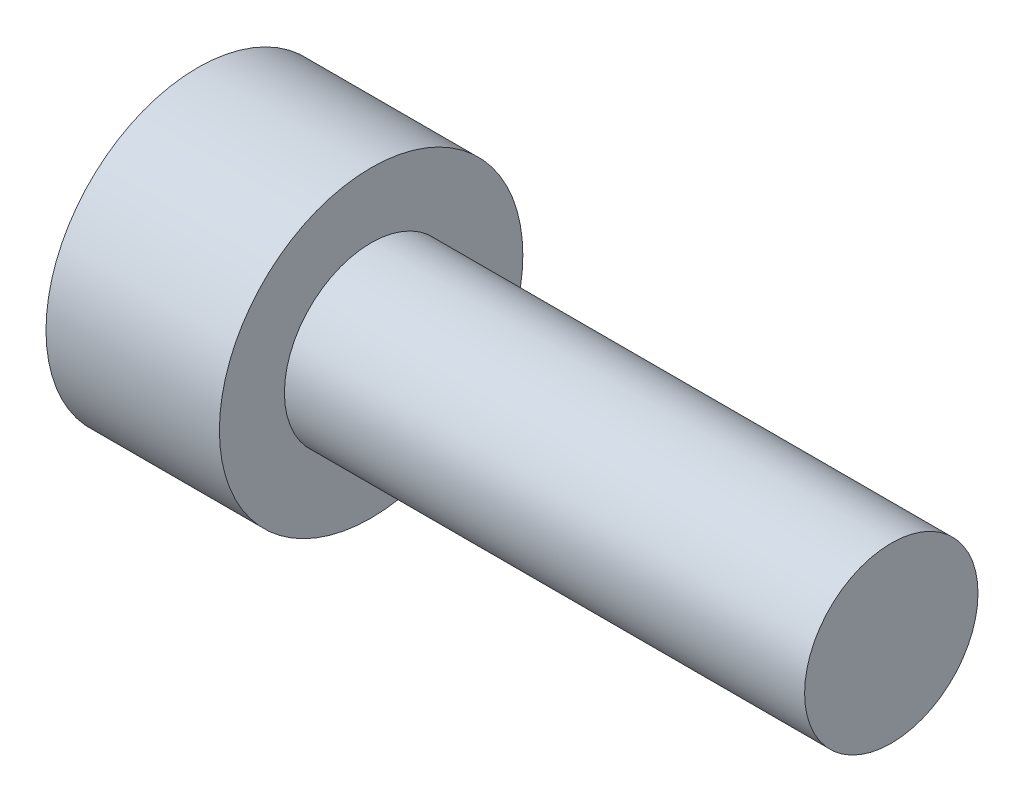
ISO-10303-21;
HEADER;
FILE_DESCRIPTION(('STEP AP214'),'2;1');
FILE_NAME('part.step','',(''),(''),'','','');
FILE_SCHEMA(('AUTOMOTIVE_DESIGN { 1 0 10303 214 1 1 1 1 }'));
ENDSEC;
DATA;
#1=APPLICATION_CONTEXT('core data for automotive mechanical design processes');
#2=APPLICATION_PROTOCOL_DEFINITION('international standard','automotive_design',2000,#1);
#3=PRODUCT_CONTEXT('',#1,'mechanical');
#4=PRODUCT('Part','Part','',(#3));
#5=PRODUCT_RELATED_PRODUCT_CATEGORY('part','',(#4));
#6=PRODUCT_DEFINITION_FORMATION('','',#4);
#7=PRODUCT_DEFINITION_CONTEXT('part definition',#1,'design');
#8=PRODUCT_DEFINITION('design','',#6,#7);
#9=PRODUCT_DEFINITION_SHAPE('','',#8);
#10=(LENGTH_UNIT() NAMED_UNIT(*) SI_UNIT(.MILLI.,.METRE.));
#11=(NAMED_UNIT(*) PLANE_ANGLE_UNIT() SI_UNIT($,.RADIAN.));
#12=(NAMED_UNIT(*) SI_UNIT($,.STERADIAN.) SOLID_ANGLE_UNIT());
#13=UNCERTAINTY_MEASURE_WITH_UNIT(LENGTH_MEASURE(1.E-05),#10,'distance_accuracy_value','');
#14=(GEOMETRIC_REPRESENTATION_CONTEXT(3) GLOBAL_UNCERTAINTY_ASSIGNED_CONTEXT((#13)) GLOBAL_UNIT_ASSIGNED_CONTEXT((#10,
#11,#12)) REPRESENTATION_CONTEXT('',''));
#15=CARTESIAN_POINT('',(0.,0.,0.));
#16=DIRECTION('',(0.,0.,1.));
#17=DIRECTION('',(1.,0.,0.));
#18=AXIS2_PLACEMENT_3D('',#15,#16,#17);
#19=CARTESIAN_POINT('',(0.,0.,0.));
#20=DIRECTION('',(1.,0.,0.));
#21=DIRECTION('',(0.,0.,-1.));
#22=AXIS2_PLACEMENT_3D('',#19,#20,#21);
#23=PLANE('',#22);
#24=CARTESIAN_POINT('',(0.,0.,0.));
#25=DIRECTION('',(-1.,0.,0.));
#26=DIRECTION('',(0.,0.,1.));
#27=AXIS2_PLACEMENT_3D('',#24,#25,#26);
#28=CIRCLE('',#27,3.5);
#29=CARTESIAN_POINT('',(0.,0.,3.5));
#30=VERTEX_POINT('',#29);
#31=EDGE_CURVE('E11',#30,#30,#28,.T.);
#32=ORIENTED_EDGE('',*,*,#31,.T.);
#33=EDGE_LOOP('',(#32));
#34=FACE_BOUND('',#33,.T.);
#35=DIRECTION('',(0.,0.5,0.866025403784439));
#36=VECTOR('',#35,1.);
#37=CARTESIAN_POINT('',(0.,-1.73205080756888,0.));
#38=LINE('',#37,#36);
#39=CARTESIAN_POINT('',(0.,-1.73205080756888,0.));
#40=VERTEX_POINT('',#39);
#41=CARTESIAN_POINT('',(0.,-0.866025403784438,1.5));
#42=VERTEX_POINT('',#41);
#43=EDGE_CURVE('E149',#40,#42,#38,.T.);
#44=ORIENTED_EDGE('',*,*,#43,.F.);
#45=DIRECTION('',(0.,-0.5,0.866025403784439));
#46=VECTOR('',#45,1.);
#47=CARTESIAN_POINT('',(0.,-0.866025403784439,-1.5));
#48=LINE('',#47,#46);
#49=CARTESIAN_POINT('',(0.,-0.866025403784439,-1.5));
#50=VERTEX_POINT('',#49);
#51=EDGE_CURVE('E49',#50,#40,#48,.T.);
#52=ORIENTED_EDGE('',*,*,#51,.F.);
#53=DIRECTION('',(0.,-1.,0.));
#54=VECTOR('',#53,1.);
#55=CARTESIAN_POINT('',(0.,0.866025403784437,-1.5));
#56=LINE('',#55,#54);
#57=CARTESIAN_POINT('',(0.,0.866025403784437,-1.5));
#58=VERTEX_POINT('',#57);
#59=EDGE_CURVE('E119',#58,#50,#56,.T.);
#60=ORIENTED_EDGE('',*,*,#59,.F.);
#61=DIRECTION('',(0.,-0.5,-0.866025403784439));
#62=VECTOR('',#61,1.);
#63=CARTESIAN_POINT('',(0.,1.73205080756888,0.));
#64=LINE('',#63,#62);
#65=CARTESIAN_POINT('',(0.,1.73205080756888,0.));
#66=VERTEX_POINT('',#65);
#67=EDGE_CURVE('E155',#66,#58,#64,.T.);
#68=ORIENTED_EDGE('',*,*,#67,.F.);
#69=DIRECTION('',(0.,0.5,-0.866025403784439));
#70=VECTOR('',#69,1.);
#71=CARTESIAN_POINT('',(0.,0.866025403784438,1.5));
#72=LINE('',#71,#70);
#73=CARTESIAN_POINT('',(0.,0.866025403784438,1.5));
#74=VERTEX_POINT('',#73);
#75=EDGE_CURVE('E153',#74,#66,#72,.T.);
#76=ORIENTED_EDGE('',*,*,#75,.F.);
#77=DIRECTION('',(0.,1.,0.));
#78=VECTOR('',#77,1.);
#79=CARTESIAN_POINT('',(0.,-0.866025403784438,1.5));
#80=LINE('',#79,#78);
#81=EDGE_CURVE('E151',#42,#74,#80,.T.);
#82=ORIENTED_EDGE('',*,*,#81,.F.);
#83=EDGE_LOOP('',(#44,#52,#60,#68,#76,#82));
#84=FACE_BOUND('',#83,.T.);
#85=ADVANCED_FACE('F35',(#34,#84),#23,.F.);
#86=CARTESIAN_POINT('',(0.,0.,0.));
#87=DIRECTION('',(-1.,0.,0.));
#88=DIRECTION('',(0.,0.,1.));
#89=AXIS2_PLACEMENT_3D('',#86,#87,#88);
#90=CYLINDRICAL_SURFACE('',#89,3.5);
#91=ORIENTED_EDGE('',*,*,#31,.F.);
#92=EDGE_LOOP('',(#91));
#93=FACE_BOUND('',#92,.T.);
#94=CARTESIAN_POINT('',(4.,0.,0.));
#95=DIRECTION('',(-1.,0.,0.));
#96=DIRECTION('',(0.,0.,1.));
#97=AXIS2_PLACEMENT_3D('',#94,#95,#96);
#98=CIRCLE('',#97,3.5);
#99=CARTESIAN_POINT('',(4.,0.,3.5));
#100=VERTEX_POINT('',#99);
#101=EDGE_CURVE('E42',#100,#100,#98,.T.);
#102=ORIENTED_EDGE('',*,*,#101,.T.);
#103=EDGE_LOOP('',(#102));
#104=FACE_BOUND('',#103,.T.);
#105=ADVANCED_FACE('F183',(#93,#104),#90,.T.);
#106=CARTESIAN_POINT('',(4.,2.,0.));
#107=DIRECTION('',(-1.,0.,0.));
#108=DIRECTION('',(0.,0.,1.));
#109=AXIS2_PLACEMENT_3D('',#106,#107,#108);
#110=PLANE('',#109);
#111=ORIENTED_EDGE('',*,*,#101,.F.);
#112=EDGE_LOOP('',(#111));
#113=FACE_BOUND('',#112,.T.);
#114=CARTESIAN_POINT('',(4.,0.,0.));
#115=DIRECTION('',(-1.,0.,0.));
#116=DIRECTION('',(0.,0.,1.));
#117=AXIS2_PLACEMENT_3D('',#114,#115,#116);
#118=CIRCLE('',#117,2.);
#119=CARTESIAN_POINT('',(4.,0.,2.));
#120=VERTEX_POINT('',#119);
#121=EDGE_CURVE('E178',#120,#120,#118,.T.);
#122=ORIENTED_EDGE('',*,*,#121,.T.);
#123=EDGE_LOOP('',(#122));
#124=FACE_BOUND('',#123,.T.);
#125=ADVANCED_FACE('F185',(#113,#124),#110,.F.);
#126=CARTESIAN_POINT('',(0.,0.,0.));
#127=DIRECTION('',(-1.,0.,0.));
#128=DIRECTION('',(0.,0.,1.));
#129=AXIS2_PLACEMENT_3D('',#126,#127,#128);
#130=CYLINDRICAL_SURFACE('',#129,2.);
#131=ORIENTED_EDGE('',*,*,#121,.F.);
#132=EDGE_LOOP('',(#131));
#133=FACE_BOUND('',#132,.T.);
#134=CARTESIAN_POINT('',(16.,0.,0.));
#135=DIRECTION('',(-1.,0.,0.));
#136=DIRECTION('',(0.,0.,1.));
#137=AXIS2_PLACEMENT_3D('',#134,#135,#136);
#138=CIRCLE('',#137,2.);
#139=CARTESIAN_POINT('',(16.,0.,2.));
#140=VERTEX_POINT('',#139);
#141=EDGE_CURVE('E174',#140,#140,#138,.T.);
#142=ORIENTED_EDGE('',*,*,#141,.T.);
#143=EDGE_LOOP('',(#142));
#144=FACE_BOUND('',#143,.T.);
#145=ADVANCED_FACE('F188',(#133,#144),#130,.T.);
#146=CARTESIAN_POINT('',(16.,2.,0.));
#147=DIRECTION('',(-1.,0.,0.));
#148=DIRECTION('',(0.,0.,1.));
#149=AXIS2_PLACEMENT_3D('',#146,#147,#148);
#150=PLANE('',#149);
#151=ORIENTED_EDGE('',*,*,#141,.F.);
#152=EDGE_LOOP('',(#151));
#153=FACE_BOUND('',#152,.T.);
#154=ADVANCED_FACE('F194',(#153),#150,.F.);
#155=CARTESIAN_POINT('',(2.,-0.866025403784439,-1.5));
#156=DIRECTION('',(0.,-0.866025403784439,-0.499999999999999));
#157=DIRECTION('',(0.,0.5,-0.866025403784439));
#158=AXIS2_PLACEMENT_3D('',#155,#156,#157);
#159=PLANE('',#158);
#160=DIRECTION('',(0.,-0.5,0.866025403784439));
#161=VECTOR('',#160,1.);
#162=CARTESIAN_POINT('',(2.,-0.866025403784439,-1.5));
#163=LINE('',#162,#161);
#164=CARTESIAN_POINT('',(2.,-0.866025403784439,-1.5));
#165=VERTEX_POINT('',#164);
#166=CARTESIAN_POINT('',(2.,-1.29903810567666,-0.749999999999999));
#167=VERTEX_POINT('',#166);
#168=EDGE_CURVE('E118',#165,#167,#163,.T.);
#169=ORIENTED_EDGE('',*,*,#168,.F.);
#170=DIRECTION('',(-1.,0.,0.));
#171=VECTOR('',#170,1.);
#172=CARTESIAN_POINT('',(2.,-0.866025403784439,-1.5));
#173=LINE('',#172,#171);
#174=EDGE_CURVE('E158',#165,#50,#173,.T.);
#175=ORIENTED_EDGE('',*,*,#174,.T.);
#176=ORIENTED_EDGE('',*,*,#51,.T.);
#177=DIRECTION('',(-1.,0.,0.));
#178=VECTOR('',#177,1.);
#179=CARTESIAN_POINT('',(2.,-1.73205080756888,0.));
#180=LINE('',#179,#178);
#181=CARTESIAN_POINT('',(2.,-1.73205080756888,0.));
#182=VERTEX_POINT('',#181);
#183=EDGE_CURVE('E121',#182,#40,#180,.T.);
#184=ORIENTED_EDGE('',*,*,#183,.F.);
#185=EDGE_CURVE('E110',#167,#182,#163,.T.);
#186=ORIENTED_EDGE('',*,*,#185,.F.);
#187=EDGE_LOOP('',(#169,#175,#176,#184,#186));
#188=FACE_BOUND('',#187,.T.);
#189=ADVANCED_FACE('F122',(#188),#159,.F.);
#190=CARTESIAN_POINT('',(2.,0.866025403784437,-1.5));
#191=DIRECTION('',(0.,0.,-1.));
#192=DIRECTION('',(-1.,0.,0.));
#193=AXIS2_PLACEMENT_3D('',#190,#191,#192);
#194=PLANE('',#193);
#195=DIRECTION('',(0.,-1.,0.));
#196=VECTOR('',#195,1.);
#197=CARTESIAN_POINT('',(2.,0.866025403784437,-1.5));
#198=LINE('',#197,#196);
#199=CARTESIAN_POINT('',(2.,0.866025403784437,-1.5));
#200=VERTEX_POINT('',#199);
#201=CARTESIAN_POINT('',(2.,0.,-1.5));
#202=VERTEX_POINT('',#201);
#203=EDGE_CURVE('E127',#200,#202,#198,.T.);
#204=ORIENTED_EDGE('',*,*,#203,.F.);
#205=DIRECTION('',(-1.,0.,0.));
#206=VECTOR('',#205,1.);
#207=CARTESIAN_POINT('',(2.,0.866025403784437,-1.5));
#208=LINE('',#207,#206);
#209=EDGE_CURVE('E160',#200,#58,#208,.T.);
#210=ORIENTED_EDGE('',*,*,#209,.T.);
#211=ORIENTED_EDGE('',*,*,#59,.T.);
#212=ORIENTED_EDGE('',*,*,#174,.F.);
#213=EDGE_CURVE('E145',#202,#165,#198,.T.);
#214=ORIENTED_EDGE('',*,*,#213,.F.);
#215=EDGE_LOOP('',(#204,#210,#211,#212,#214));
#216=FACE_BOUND('',#215,.T.);
#217=ADVANCED_FACE('F203',(#216),#194,.F.);
#218=CARTESIAN_POINT('',(2.,1.73205080756888,0.));
#219=DIRECTION('',(0.,0.866025403784439,-0.5));
#220=DIRECTION('',(0.,0.5,0.866025403784439));
#221=AXIS2_PLACEMENT_3D('',#218,#219,#220);
#222=PLANE('',#221);
#223=DIRECTION('',(0.,-0.5,-0.866025403784439));
#224=VECTOR('',#223,1.);
#225=CARTESIAN_POINT('',(2.,1.73205080756888,0.));
#226=LINE('',#225,#224);
#227=CARTESIAN_POINT('',(2.,1.73205080756888,0.));
#228=VERTEX_POINT('',#227);
#229=CARTESIAN_POINT('',(2.,1.29903810567666,-0.749999999999999));
#230=VERTEX_POINT('',#229);
#231=EDGE_CURVE('E142',#228,#230,#226,.T.);
#232=ORIENTED_EDGE('',*,*,#231,.F.);
#233=DIRECTION('',(-1.,0.,0.));
#234=VECTOR('',#233,1.);
#235=CARTESIAN_POINT('',(2.,1.73205080756888,0.));
#236=LINE('',#235,#234);
#237=EDGE_CURVE('E163',#228,#66,#236,.T.);
#238=ORIENTED_EDGE('',*,*,#237,.T.);
#239=ORIENTED_EDGE('',*,*,#67,.T.);
#240=ORIENTED_EDGE('',*,*,#209,.F.);
#241=EDGE_CURVE('E141',#230,#200,#226,.T.);
#242=ORIENTED_EDGE('',*,*,#241,.F.);
#243=EDGE_LOOP('',(#232,#238,#239,#240,#242));
#244=FACE_BOUND('',#243,.T.);
#245=ADVANCED_FACE('F256',(#244),#222,.F.);
#246=CARTESIAN_POINT('',(2.,0.866025403784438,1.5));
#247=DIRECTION('',(0.,0.866025403784439,0.5));
#248=DIRECTION('',(0.,-0.5,0.866025403784439));
#249=AXIS2_PLACEMENT_3D('',#246,#247,#248);
#250=PLANE('',#249);
#251=DIRECTION('',(0.,0.5,-0.866025403784439));
#252=VECTOR('',#251,1.);
#253=CARTESIAN_POINT('',(2.,0.866025403784438,1.5));
#254=LINE('',#253,#252);
#255=CARTESIAN_POINT('',(2.,0.866025403784438,1.5));
#256=VERTEX_POINT('',#255);
#257=CARTESIAN_POINT('',(2.,1.29903810567666,0.749999999999999));
#258=VERTEX_POINT('',#257);
#259=EDGE_CURVE('E138',#256,#258,#254,.T.);
#260=ORIENTED_EDGE('',*,*,#259,.F.);
#261=DIRECTION('',(-1.,0.,0.));
#262=VECTOR('',#261,1.);
#263=CARTESIAN_POINT('',(2.,0.866025403784438,1.5));
#264=LINE('',#263,#262);
#265=EDGE_CURVE('E166',#256,#74,#264,.T.);
#266=ORIENTED_EDGE('',*,*,#265,.T.);
#267=ORIENTED_EDGE('',*,*,#75,.T.);
#268=ORIENTED_EDGE('',*,*,#237,.F.);
#269=EDGE_CURVE('E137',#258,#228,#254,.T.);
#270=ORIENTED_EDGE('',*,*,#269,.F.);
#271=EDGE_LOOP('',(#260,#266,#267,#268,#270));
#272=FACE_BOUND('',#271,.T.);
#273=ADVANCED_FACE('F251',(#272),#250,.F.);
#274=CARTESIAN_POINT('',(2.,-0.866025403784438,1.5));
#275=DIRECTION('',(0.,0.,1.));
#276=DIRECTION('',(0.,-1.,0.));
#277=AXIS2_PLACEMENT_3D('',#274,#275,#276);
#278=PLANE('',#277);
#279=DIRECTION('',(0.,1.,0.));
#280=VECTOR('',#279,1.);
#281=CARTESIAN_POINT('',(2.,-0.866025403784438,1.5));
#282=LINE('',#281,#280);
#283=CARTESIAN_POINT('',(2.,-0.866025403784438,1.5));
#284=VERTEX_POINT('',#283);
#285=CARTESIAN_POINT('',(2.,0.,1.5));
#286=VERTEX_POINT('',#285);
#287=EDGE_CURVE('E57',#284,#286,#282,.T.);
#288=ORIENTED_EDGE('',*,*,#287,.F.);
#289=DIRECTION('',(-1.,0.,0.));
#290=VECTOR('',#289,1.);
#291=CARTESIAN_POINT('',(2.,-0.866025403784438,1.5));
#292=LINE('',#291,#290);
#293=EDGE_CURVE('E126',#284,#42,#292,.T.);
#294=ORIENTED_EDGE('',*,*,#293,.T.);
#295=ORIENTED_EDGE('',*,*,#81,.T.);
#296=ORIENTED_EDGE('',*,*,#265,.F.);
#297=EDGE_CURVE('E133',#286,#256,#282,.T.);
#298=ORIENTED_EDGE('',*,*,#297,.F.);
#299=EDGE_LOOP('',(#288,#294,#295,#296,#298));
#300=FACE_BOUND('',#299,.T.);
#301=ADVANCED_FACE('F217',(#300),#278,.F.);
#302=CARTESIAN_POINT('',(2.,-1.73205080756888,0.));
#303=DIRECTION('',(0.,-0.866025403784439,0.5));
#304=DIRECTION('',(0.,-0.5,-0.866025403784439));
#305=AXIS2_PLACEMENT_3D('',#302,#303,#304);
#306=PLANE('',#305);
#307=DIRECTION('',(0.,0.5,0.866025403784439));
#308=VECTOR('',#307,1.);
#309=CARTESIAN_POINT('',(2.,-1.73205080756888,0.));
#310=LINE('',#309,#308);
#311=CARTESIAN_POINT('',(2.,-1.29903810567666,0.75));
#312=VERTEX_POINT('',#311);
#313=EDGE_CURVE('E113',#182,#312,#310,.T.);
#314=ORIENTED_EDGE('',*,*,#313,.F.);
#315=ORIENTED_EDGE('',*,*,#183,.T.);
#316=ORIENTED_EDGE('',*,*,#43,.T.);
#317=ORIENTED_EDGE('',*,*,#293,.F.);
#318=EDGE_CURVE('E132',#312,#284,#310,.T.);
#319=ORIENTED_EDGE('',*,*,#318,.F.);
#320=EDGE_LOOP('',(#314,#315,#316,#317,#319));
#321=FACE_BOUND('',#320,.T.);
#322=ADVANCED_FACE('F130',(#321),#306,.F.);
#323=CARTESIAN_POINT('',(2.,0.,0.));
#324=DIRECTION('',(-1.,0.,0.));
#325=DIRECTION('',(0.,0.,1.));
#326=AXIS2_PLACEMENT_3D('',#323,#324,#325);
#327=PLANE('',#326);
#328=ORIENTED_EDGE('',*,*,#297,.T.);
#329=ORIENTED_EDGE('',*,*,#259,.T.);
#330=CARTESIAN_POINT('',(2.,0.,0.));
#331=DIRECTION('',(-1.,0.,0.));
#332=DIRECTION('',(0.,-1.,0.));
#333=AXIS2_PLACEMENT_3D('',#330,#331,#332);
#334=CIRCLE('',#333,1.5);
#335=EDGE_CURVE('E175',#286,#258,#334,.T.);
#336=ORIENTED_EDGE('',*,*,#335,.F.);
#337=EDGE_LOOP('',(#328,#329,#336));
#338=FACE_BOUND('',#337,.T.);
#339=ADVANCED_FACE('F223',(#338),#327,.T.);
#340=ORIENTED_EDGE('',*,*,#269,.T.);
#341=ORIENTED_EDGE('',*,*,#231,.T.);
#342=EDGE_CURVE('E226',#258,#230,#334,.T.);
#343=ORIENTED_EDGE('',*,*,#342,.F.);
#344=EDGE_LOOP('',(#340,#341,#343));
#345=FACE_BOUND('',#344,.T.);
#346=ADVANCED_FACE('F240',(#345),#327,.T.);
#347=ORIENTED_EDGE('',*,*,#241,.T.);
#348=ORIENTED_EDGE('',*,*,#203,.T.);
#349=EDGE_CURVE('E270',#230,#202,#334,.T.);
#350=ORIENTED_EDGE('',*,*,#349,.F.);
#351=EDGE_LOOP('',(#347,#348,#350));
#352=FACE_BOUND('',#351,.T.);
#353=ADVANCED_FACE('F245',(#352),#327,.T.);
#354=ORIENTED_EDGE('',*,*,#213,.T.);
#355=ORIENTED_EDGE('',*,*,#168,.T.);
#356=EDGE_CURVE('E272',#202,#167,#334,.T.);
#357=ORIENTED_EDGE('',*,*,#356,.F.);
#358=EDGE_LOOP('',(#354,#355,#357));
#359=FACE_BOUND('',#358,.T.);
#360=ADVANCED_FACE('F237',(#359),#327,.T.);
#361=ORIENTED_EDGE('',*,*,#185,.T.);
#362=ORIENTED_EDGE('',*,*,#313,.T.);
#363=EDGE_CURVE('E115',#167,#312,#334,.T.);
#364=ORIENTED_EDGE('',*,*,#363,.F.);
#365=EDGE_LOOP('',(#361,#362,#364));
#366=FACE_BOUND('',#365,.T.);
#367=ADVANCED_FACE('F111',(#366),#327,.T.);
#368=ORIENTED_EDGE('',*,*,#318,.T.);
#369=ORIENTED_EDGE('',*,*,#287,.T.);
#370=EDGE_CURVE('E171',#312,#286,#334,.T.);
#371=ORIENTED_EDGE('',*,*,#370,.F.);
#372=EDGE_LOOP('',(#368,#369,#371));
#373=FACE_BOUND('',#372,.T.);
#374=ADVANCED_FACE('F230',(#373),#327,.T.);
#375=CARTESIAN_POINT('',(2.86602540378443,0.,0.));
#376=DIRECTION('',(-1.,0.,0.));
#377=DIRECTION('',(0.,-1.,0.));
#378=AXIS2_PLACEMENT_3D('',#375,#376,#377);
#379=CONICAL_SURFACE('',#378,0.,1.0471975511966);
#380=ORIENTED_EDGE('',*,*,#370,.T.);
#381=ORIENTED_EDGE('',*,*,#335,.T.);
#382=ORIENTED_EDGE('',*,*,#342,.T.);
#383=ORIENTED_EDGE('',*,*,#349,.T.);
#384=ORIENTED_EDGE('',*,*,#356,.T.);
#385=ORIENTED_EDGE('',*,*,#363,.T.);
#386=EDGE_LOOP('',(#380,#381,#382,#383,#384,#385));
#387=FACE_BOUND('',#386,.T.);
#388=CARTESIAN_POINT('',(2.86602540378443,0.,0.));
#389=VERTEX_POINT('',#388);
#390=VERTEX_LOOP('',#389);
#391=FACE_BOUND('',#390,.T.);
#392=ADVANCED_FACE('F227',(#387,#391),#379,.F.);
#393=CLOSED_SHELL('',(#85,#105,#125,#145,#154,#189,#217,#245,#273,#301,#322,#339,#346,#353,#360,
#367,#374,#392));
#394=MANIFOLD_SOLID_BREP('B2',#393);
#395=ADVANCED_BREP_SHAPE_REPRESENTATION('',(#18,#394),#14);
#396=SHAPE_DEFINITION_REPRESENTATION(#9,#395);
ENDSEC;
END-ISO-10303-21;
